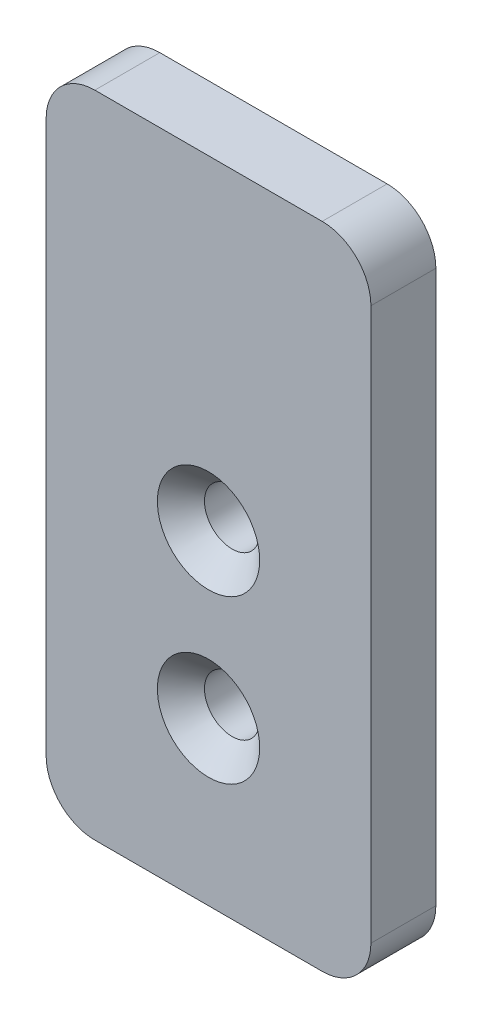
ISO-10303-21;
HEADER;
FILE_DESCRIPTION(('STEP AP214'),'2;1');
FILE_NAME('part.step','',(''),(''),'','','');
FILE_SCHEMA(('AUTOMOTIVE_DESIGN { 1 0 10303 214 1 1 1 1 }'));
ENDSEC;
DATA;
#1=APPLICATION_CONTEXT('core data for automotive mechanical design processes');
#2=APPLICATION_PROTOCOL_DEFINITION('international standard','automotive_design',2000,#1);
#3=PRODUCT_CONTEXT('',#1,'mechanical');
#4=PRODUCT('Part','Part','',(#3));
#5=PRODUCT_RELATED_PRODUCT_CATEGORY('part','',(#4));
#6=PRODUCT_DEFINITION_FORMATION('','',#4);
#7=PRODUCT_DEFINITION_CONTEXT('part definition',#1,'design');
#8=PRODUCT_DEFINITION('design','',#6,#7);
#9=PRODUCT_DEFINITION_SHAPE('','',#8);
#10=(LENGTH_UNIT() NAMED_UNIT(*) SI_UNIT(.MILLI.,.METRE.));
#11=(NAMED_UNIT(*) PLANE_ANGLE_UNIT() SI_UNIT($,.RADIAN.));
#12=(NAMED_UNIT(*) SI_UNIT($,.STERADIAN.) SOLID_ANGLE_UNIT());
#13=UNCERTAINTY_MEASURE_WITH_UNIT(LENGTH_MEASURE(1.E-05),#10,'distance_accuracy_value','');
#14=(GEOMETRIC_REPRESENTATION_CONTEXT(3) GLOBAL_UNCERTAINTY_ASSIGNED_CONTEXT((#13)) GLOBAL_UNIT_ASSIGNED_CONTEXT((#10,
#11,#12)) REPRESENTATION_CONTEXT('',''));
#15=CARTESIAN_POINT('',(0.,0.,0.));
#16=DIRECTION('',(0.,0.,1.));
#17=DIRECTION('',(1.,0.,0.));
#18=AXIS2_PLACEMENT_3D('',#15,#16,#17);
#19=CARTESIAN_POINT('',(10.,-20.,4.));
#20=DIRECTION('',(-1.,0.,0.));
#21=DIRECTION('',(0.,0.,1.));
#22=AXIS2_PLACEMENT_3D('',#19,#20,#21);
#23=PLANE('',#22);
#24=DIRECTION('',(0.,1.,0.));
#25=VECTOR('',#24,1.);
#26=CARTESIAN_POINT('',(10.,-20.,0.));
#27=LINE('',#26,#25);
#28=CARTESIAN_POINT('',(10.,-17.,0.));
#29=VERTEX_POINT('',#28);
#30=CARTESIAN_POINT('',(10.,17.,0.));
#31=VERTEX_POINT('',#30);
#32=EDGE_CURVE('E112',#29,#31,#27,.T.);
#33=ORIENTED_EDGE('',*,*,#32,.T.);
#34=DIRECTION('',(0.,0.,-1.));
#35=VECTOR('',#34,1.);
#36=CARTESIAN_POINT('',(10.,17.,4.));
#37=LINE('',#36,#35);
#38=CARTESIAN_POINT('',(10.,17.,4.));
#39=VERTEX_POINT('',#38);
#40=EDGE_CURVE('E135',#31,#39,#37,.F.);
#41=ORIENTED_EDGE('',*,*,#40,.T.);
#42=DIRECTION('',(0.,1.,0.));
#43=VECTOR('',#42,1.);
#44=CARTESIAN_POINT('',(10.,-20.,4.));
#45=LINE('',#44,#43);
#46=CARTESIAN_POINT('',(10.,-17.,4.));
#47=VERTEX_POINT('',#46);
#48=EDGE_CURVE('E110',#47,#39,#45,.T.);
#49=ORIENTED_EDGE('',*,*,#48,.F.);
#50=DIRECTION('',(0.,0.,-1.));
#51=VECTOR('',#50,1.);
#52=CARTESIAN_POINT('',(10.,-17.,4.));
#53=LINE('',#52,#51);
#54=EDGE_CURVE('E132',#47,#29,#53,.T.);
#55=ORIENTED_EDGE('',*,*,#54,.T.);
#56=EDGE_LOOP('',(#33,#41,#49,#55));
#57=FACE_BOUND('',#56,.T.);
#58=ADVANCED_FACE('F17',(#57),#23,.F.);
#59=CARTESIAN_POINT('',(-10.,20.,4.));
#60=DIRECTION('',(0.,-1.,0.));
#61=DIRECTION('',(0.,0.,-1.));
#62=AXIS2_PLACEMENT_3D('',#59,#60,#61);
#63=PLANE('',#62);
#64=DIRECTION('',(-1.,0.,0.));
#65=VECTOR('',#64,1.);
#66=CARTESIAN_POINT('',(-10.,20.,0.));
#67=LINE('',#66,#65);
#68=CARTESIAN_POINT('',(7.,20.,0.));
#69=VERTEX_POINT('',#68);
#70=CARTESIAN_POINT('',(-7.,20.,0.));
#71=VERTEX_POINT('',#70);
#72=EDGE_CURVE('E108',#69,#71,#67,.T.);
#73=ORIENTED_EDGE('',*,*,#72,.T.);
#74=DIRECTION('',(0.,0.,-1.));
#75=VECTOR('',#74,1.);
#76=CARTESIAN_POINT('',(-7.,20.,4.));
#77=LINE('',#76,#75);
#78=CARTESIAN_POINT('',(-7.,20.,4.));
#79=VERTEX_POINT('',#78);
#80=EDGE_CURVE('E87',#71,#79,#77,.F.);
#81=ORIENTED_EDGE('',*,*,#80,.T.);
#82=DIRECTION('',(-1.,0.,0.));
#83=VECTOR('',#82,1.);
#84=CARTESIAN_POINT('',(-10.,20.,4.));
#85=LINE('',#84,#83);
#86=CARTESIAN_POINT('',(7.,20.,4.));
#87=VERTEX_POINT('',#86);
#88=EDGE_CURVE('E151',#87,#79,#85,.T.);
#89=ORIENTED_EDGE('',*,*,#88,.F.);
#90=DIRECTION('',(0.,0.,-1.));
#91=VECTOR('',#90,1.);
#92=CARTESIAN_POINT('',(7.,20.,4.));
#93=LINE('',#92,#91);
#94=EDGE_CURVE('E92',#87,#69,#93,.T.);
#95=ORIENTED_EDGE('',*,*,#94,.T.);
#96=EDGE_LOOP('',(#73,#81,#89,#95));
#97=FACE_BOUND('',#96,.T.);
#98=ADVANCED_FACE('F191',(#97),#63,.F.);
#99=CARTESIAN_POINT('',(-10.,-20.,4.));
#100=DIRECTION('',(1.,0.,0.));
#101=DIRECTION('',(0.,0.,-1.));
#102=AXIS2_PLACEMENT_3D('',#99,#100,#101);
#103=PLANE('',#102);
#104=DIRECTION('',(0.,-1.,0.));
#105=VECTOR('',#104,1.);
#106=CARTESIAN_POINT('',(-10.,-20.,4.));
#107=LINE('',#106,#105);
#108=CARTESIAN_POINT('',(-10.,17.,4.));
#109=VERTEX_POINT('',#108);
#110=CARTESIAN_POINT('',(-10.,-17.,4.));
#111=VERTEX_POINT('',#110);
#112=EDGE_CURVE('E101',#109,#111,#107,.T.);
#113=ORIENTED_EDGE('',*,*,#112,.F.);
#114=DIRECTION('',(0.,0.,-1.));
#115=VECTOR('',#114,1.);
#116=CARTESIAN_POINT('',(-10.,17.,4.));
#117=LINE('',#116,#115);
#118=CARTESIAN_POINT('',(-10.,17.,0.));
#119=VERTEX_POINT('',#118);
#120=EDGE_CURVE('E86',#109,#119,#117,.T.);
#121=ORIENTED_EDGE('',*,*,#120,.T.);
#122=DIRECTION('',(0.,-1.,0.));
#123=VECTOR('',#122,1.);
#124=CARTESIAN_POINT('',(-10.,-20.,0.));
#125=LINE('',#124,#123);
#126=CARTESIAN_POINT('',(-10.,-17.,0.));
#127=VERTEX_POINT('',#126);
#128=EDGE_CURVE('E99',#119,#127,#125,.T.);
#129=ORIENTED_EDGE('',*,*,#128,.T.);
#130=DIRECTION('',(0.,0.,-1.));
#131=VECTOR('',#130,1.);
#132=CARTESIAN_POINT('',(-10.,-17.,4.));
#133=LINE('',#132,#131);
#134=EDGE_CURVE('E103',#127,#111,#133,.F.);
#135=ORIENTED_EDGE('',*,*,#134,.T.);
#136=EDGE_LOOP('',(#113,#121,#129,#135));
#137=FACE_BOUND('',#136,.T.);
#138=ADVANCED_FACE('F98',(#137),#103,.F.);
#139=CARTESIAN_POINT('',(-10.,-20.,4.));
#140=DIRECTION('',(0.,1.,0.));
#141=DIRECTION('',(0.,0.,1.));
#142=AXIS2_PLACEMENT_3D('',#139,#140,#141);
#143=PLANE('',#142);
#144=DIRECTION('',(1.,0.,0.));
#145=VECTOR('',#144,1.);
#146=CARTESIAN_POINT('',(-10.,-20.,0.));
#147=LINE('',#146,#145);
#148=CARTESIAN_POINT('',(-7.,-20.,0.));
#149=VERTEX_POINT('',#148);
#150=CARTESIAN_POINT('',(7.,-20.,0.));
#151=VERTEX_POINT('',#150);
#152=EDGE_CURVE('E107',#149,#151,#147,.T.);
#153=ORIENTED_EDGE('',*,*,#152,.T.);
#154=DIRECTION('',(0.,0.,-1.));
#155=VECTOR('',#154,1.);
#156=CARTESIAN_POINT('',(7.,-20.,4.));
#157=LINE('',#156,#155);
#158=CARTESIAN_POINT('',(7.,-20.,4.));
#159=VERTEX_POINT('',#158);
#160=EDGE_CURVE('E11',#151,#159,#157,.F.);
#161=ORIENTED_EDGE('',*,*,#160,.T.);
#162=DIRECTION('',(1.,0.,0.));
#163=VECTOR('',#162,1.);
#164=CARTESIAN_POINT('',(-10.,-20.,4.));
#165=LINE('',#164,#163);
#166=CARTESIAN_POINT('',(-7.,-20.,4.));
#167=VERTEX_POINT('',#166);
#168=EDGE_CURVE('E116',#167,#159,#165,.T.);
#169=ORIENTED_EDGE('',*,*,#168,.F.);
#170=DIRECTION('',(0.,0.,-1.));
#171=VECTOR('',#170,1.);
#172=CARTESIAN_POINT('',(-7.,-20.,4.));
#173=LINE('',#172,#171);
#174=EDGE_CURVE('E25',#167,#149,#173,.T.);
#175=ORIENTED_EDGE('',*,*,#174,.T.);
#176=EDGE_LOOP('',(#153,#161,#169,#175));
#177=FACE_BOUND('',#176,.T.);
#178=ADVANCED_FACE('F138',(#177),#143,.F.);
#179=CARTESIAN_POINT('',(0.,0.,4.));
#180=DIRECTION('',(0.,0.,-1.));
#181=DIRECTION('',(-1.,0.,0.));
#182=AXIS2_PLACEMENT_3D('',#179,#180,#181);
#183=PLANE('',#182);
#184=CARTESIAN_POINT('',(0.,0.,4.));
#185=DIRECTION('',(0.,0.,1.));
#186=DIRECTION('',(1.,0.,0.));
#187=AXIS2_PLACEMENT_3D('',#184,#185,#186);
#188=CIRCLE('',#187,3.15);
#189=CARTESIAN_POINT('',(3.15,0.,4.));
#190=VERTEX_POINT('',#189);
#191=EDGE_CURVE('E177',#190,#190,#188,.T.);
#192=ORIENTED_EDGE('',*,*,#191,.F.);
#193=EDGE_LOOP('',(#192));
#194=FACE_BOUND('',#193,.T.);
#195=CARTESIAN_POINT('',(0.,-10.,4.));
#196=DIRECTION('',(0.,0.,1.));
#197=DIRECTION('',(1.,0.,0.));
#198=AXIS2_PLACEMENT_3D('',#195,#196,#197);
#199=CIRCLE('',#198,3.15);
#200=CARTESIAN_POINT('',(3.15,-10.,4.));
#201=VERTEX_POINT('',#200);
#202=EDGE_CURVE('E165',#201,#201,#199,.T.);
#203=ORIENTED_EDGE('',*,*,#202,.F.);
#204=EDGE_LOOP('',(#203));
#205=FACE_BOUND('',#204,.T.);
#206=ORIENTED_EDGE('',*,*,#88,.T.);
#207=CARTESIAN_POINT('',(-7.,17.,4.));
#208=DIRECTION('',(0.,0.,-1.));
#209=DIRECTION('',(-1.,0.,0.));
#210=AXIS2_PLACEMENT_3D('',#207,#208,#209);
#211=CIRCLE('',#210,3.);
#212=EDGE_CURVE('E130',#79,#109,#211,.F.);
#213=ORIENTED_EDGE('',*,*,#212,.T.);
#214=ORIENTED_EDGE('',*,*,#112,.T.);
#215=CARTESIAN_POINT('',(-7.,-17.,4.));
#216=DIRECTION('',(0.,0.,-1.));
#217=DIRECTION('',(-1.,0.,0.));
#218=AXIS2_PLACEMENT_3D('',#215,#216,#217);
#219=CIRCLE('',#218,3.);
#220=EDGE_CURVE('E37',#111,#167,#219,.F.);
#221=ORIENTED_EDGE('',*,*,#220,.T.);
#222=ORIENTED_EDGE('',*,*,#168,.T.);
#223=CARTESIAN_POINT('',(7.,-17.,4.));
#224=DIRECTION('',(0.,0.,-1.));
#225=DIRECTION('',(-1.,0.,0.));
#226=AXIS2_PLACEMENT_3D('',#223,#224,#225);
#227=CIRCLE('',#226,3.);
#228=EDGE_CURVE('E126',#159,#47,#227,.F.);
#229=ORIENTED_EDGE('',*,*,#228,.T.);
#230=ORIENTED_EDGE('',*,*,#48,.T.);
#231=CARTESIAN_POINT('',(7.,17.,4.));
#232=DIRECTION('',(0.,0.,-1.));
#233=DIRECTION('',(-1.,0.,0.));
#234=AXIS2_PLACEMENT_3D('',#231,#232,#233);
#235=CIRCLE('',#234,3.);
#236=EDGE_CURVE('E128',#39,#87,#235,.F.);
#237=ORIENTED_EDGE('',*,*,#236,.T.);
#238=EDGE_LOOP('',(#206,#213,#214,#221,#222,#229,#230,#237));
#239=FACE_BOUND('',#238,.T.);
#240=ADVANCED_FACE('F183',(#194,#205,#239),#183,.F.);
#241=CARTESIAN_POINT('',(0.,0.,0.));
#242=DIRECTION('',(0.,0.,-1.));
#243=DIRECTION('',(-1.,0.,0.));
#244=AXIS2_PLACEMENT_3D('',#241,#242,#243);
#245=PLANE('',#244);
#246=CARTESIAN_POINT('',(0.,0.,0.));
#247=DIRECTION('',(0.,0.,1.));
#248=DIRECTION('',(1.,0.,0.));
#249=AXIS2_PLACEMENT_3D('',#246,#247,#248);
#250=CIRCLE('',#249,1.7);
#251=CARTESIAN_POINT('',(1.7,0.,0.));
#252=VERTEX_POINT('',#251);
#253=EDGE_CURVE('E169',#252,#252,#250,.T.);
#254=ORIENTED_EDGE('',*,*,#253,.T.);
#255=EDGE_LOOP('',(#254));
#256=FACE_BOUND('',#255,.T.);
#257=CARTESIAN_POINT('',(0.,-10.,0.));
#258=DIRECTION('',(0.,0.,1.));
#259=DIRECTION('',(1.,0.,0.));
#260=AXIS2_PLACEMENT_3D('',#257,#258,#259);
#261=CIRCLE('',#260,1.7);
#262=CARTESIAN_POINT('',(1.7,-10.,0.));
#263=VERTEX_POINT('',#262);
#264=EDGE_CURVE('E156',#263,#263,#261,.T.);
#265=ORIENTED_EDGE('',*,*,#264,.T.);
#266=EDGE_LOOP('',(#265));
#267=FACE_BOUND('',#266,.T.);
#268=ORIENTED_EDGE('',*,*,#128,.F.);
#269=CARTESIAN_POINT('',(-7.,17.,0.));
#270=DIRECTION('',(0.,0.,-1.));
#271=DIRECTION('',(-1.,0.,0.));
#272=AXIS2_PLACEMENT_3D('',#269,#270,#271);
#273=CIRCLE('',#272,3.);
#274=EDGE_CURVE('E82',#119,#71,#273,.T.);
#275=ORIENTED_EDGE('',*,*,#274,.T.);
#276=ORIENTED_EDGE('',*,*,#72,.F.);
#277=CARTESIAN_POINT('',(7.,17.,0.));
#278=DIRECTION('',(0.,0.,-1.));
#279=DIRECTION('',(-1.,0.,0.));
#280=AXIS2_PLACEMENT_3D('',#277,#278,#279);
#281=CIRCLE('',#280,3.);
#282=EDGE_CURVE('E93',#69,#31,#281,.T.);
#283=ORIENTED_EDGE('',*,*,#282,.T.);
#284=ORIENTED_EDGE('',*,*,#32,.F.);
#285=CARTESIAN_POINT('',(7.,-17.,0.));
#286=DIRECTION('',(0.,0.,-1.));
#287=DIRECTION('',(-1.,0.,0.));
#288=AXIS2_PLACEMENT_3D('',#285,#286,#287);
#289=CIRCLE('',#288,3.);
#290=EDGE_CURVE('E119',#29,#151,#289,.T.);
#291=ORIENTED_EDGE('',*,*,#290,.T.);
#292=ORIENTED_EDGE('',*,*,#152,.F.);
#293=CARTESIAN_POINT('',(-7.,-17.,0.));
#294=DIRECTION('',(0.,0.,-1.));
#295=DIRECTION('',(-1.,0.,0.));
#296=AXIS2_PLACEMENT_3D('',#293,#294,#295);
#297=CIRCLE('',#296,3.);
#298=EDGE_CURVE('E102',#149,#127,#297,.T.);
#299=ORIENTED_EDGE('',*,*,#298,.T.);
#300=EDGE_LOOP('',(#268,#275,#276,#283,#284,#291,#292,#299));
#301=FACE_BOUND('',#300,.T.);
#302=ADVANCED_FACE('F105',(#256,#267,#301),#245,.T.);
#303=CARTESIAN_POINT('',(0.,-10.,4.));
#304=DIRECTION('',(0.,0.,1.));
#305=DIRECTION('',(1.,0.,0.));
#306=AXIS2_PLACEMENT_3D('',#303,#304,#305);
#307=CYLINDRICAL_SURFACE('',#306,1.7);
#308=ORIENTED_EDGE('',*,*,#264,.F.);
#309=EDGE_LOOP('',(#308));
#310=FACE_BOUND('',#309,.T.);
#311=CARTESIAN_POINT('',(0.,-10.,2.55));
#312=DIRECTION('',(0.,0.,1.));
#313=DIRECTION('',(1.,0.,0.));
#314=AXIS2_PLACEMENT_3D('',#311,#312,#313);
#315=CIRCLE('',#314,1.7);
#316=CARTESIAN_POINT('',(1.7,-10.,2.55));
#317=VERTEX_POINT('',#316);
#318=EDGE_CURVE('E161',#317,#317,#315,.T.);
#319=ORIENTED_EDGE('',*,*,#318,.T.);
#320=EDGE_LOOP('',(#319));
#321=FACE_BOUND('',#320,.T.);
#322=ADVANCED_FACE('F214',(#310,#321),#307,.F.);
#323=CARTESIAN_POINT('',(0.,-10.,4.));
#324=DIRECTION('',(0.,0.,1.));
#325=DIRECTION('',(1.,0.,0.));
#326=AXIS2_PLACEMENT_3D('',#323,#324,#325);
#327=CONICAL_SURFACE('',#326,3.15,0.785398163397448);
#328=ORIENTED_EDGE('',*,*,#318,.F.);
#329=EDGE_LOOP('',(#328));
#330=FACE_BOUND('',#329,.T.);
#331=ORIENTED_EDGE('',*,*,#202,.T.);
#332=EDGE_LOOP('',(#331));
#333=FACE_BOUND('',#332,.T.);
#334=ADVANCED_FACE('F219',(#330,#333),#327,.F.);
#335=CARTESIAN_POINT('',(0.,0.,4.));
#336=DIRECTION('',(0.,0.,1.));
#337=DIRECTION('',(1.,0.,0.));
#338=AXIS2_PLACEMENT_3D('',#335,#336,#337);
#339=CYLINDRICAL_SURFACE('',#338,1.7);
#340=ORIENTED_EDGE('',*,*,#253,.F.);
#341=EDGE_LOOP('',(#340));
#342=FACE_BOUND('',#341,.T.);
#343=CARTESIAN_POINT('',(0.,0.,2.55));
#344=DIRECTION('',(0.,0.,1.));
#345=DIRECTION('',(1.,0.,0.));
#346=AXIS2_PLACEMENT_3D('',#343,#344,#345);
#347=CIRCLE('',#346,1.7);
#348=CARTESIAN_POINT('',(1.7,0.,2.55));
#349=VERTEX_POINT('',#348);
#350=EDGE_CURVE('E174',#349,#349,#347,.T.);
#351=ORIENTED_EDGE('',*,*,#350,.T.);
#352=EDGE_LOOP('',(#351));
#353=FACE_BOUND('',#352,.T.);
#354=ADVANCED_FACE('F223',(#342,#353),#339,.F.);
#355=CARTESIAN_POINT('',(0.,0.,4.));
#356=DIRECTION('',(0.,0.,1.));
#357=DIRECTION('',(1.,0.,0.));
#358=AXIS2_PLACEMENT_3D('',#355,#356,#357);
#359=CONICAL_SURFACE('',#358,3.15,0.785398163397448);
#360=ORIENTED_EDGE('',*,*,#350,.F.);
#361=EDGE_LOOP('',(#360));
#362=FACE_BOUND('',#361,.T.);
#363=ORIENTED_EDGE('',*,*,#191,.T.);
#364=EDGE_LOOP('',(#363));
#365=FACE_BOUND('',#364,.T.);
#366=ADVANCED_FACE('F181',(#362,#365),#359,.F.);
#367=CARTESIAN_POINT('',(-7.,17.,4.));
#368=DIRECTION('',(0.,0.,-1.));
#369=DIRECTION('',(-1.,0.,0.));
#370=AXIS2_PLACEMENT_3D('',#367,#368,#369);
#371=CYLINDRICAL_SURFACE('',#370,3.);
#372=ORIENTED_EDGE('',*,*,#212,.F.);
#373=ORIENTED_EDGE('',*,*,#80,.F.);
#374=ORIENTED_EDGE('',*,*,#274,.F.);
#375=ORIENTED_EDGE('',*,*,#120,.F.);
#376=EDGE_LOOP('',(#372,#373,#374,#375));
#377=FACE_BOUND('',#376,.T.);
#378=ADVANCED_FACE('F85',(#377),#371,.T.);
#379=CARTESIAN_POINT('',(7.,17.,4.));
#380=DIRECTION('',(0.,0.,-1.));
#381=DIRECTION('',(-1.,0.,0.));
#382=AXIS2_PLACEMENT_3D('',#379,#380,#381);
#383=CYLINDRICAL_SURFACE('',#382,3.);
#384=ORIENTED_EDGE('',*,*,#236,.F.);
#385=ORIENTED_EDGE('',*,*,#40,.F.);
#386=ORIENTED_EDGE('',*,*,#282,.F.);
#387=ORIENTED_EDGE('',*,*,#94,.F.);
#388=EDGE_LOOP('',(#384,#385,#386,#387));
#389=FACE_BOUND('',#388,.T.);
#390=ADVANCED_FACE('F193',(#389),#383,.T.);
#391=CARTESIAN_POINT('',(7.,-17.,4.));
#392=DIRECTION('',(0.,0.,-1.));
#393=DIRECTION('',(-1.,0.,0.));
#394=AXIS2_PLACEMENT_3D('',#391,#392,#393);
#395=CYLINDRICAL_SURFACE('',#394,3.);
#396=ORIENTED_EDGE('',*,*,#228,.F.);
#397=ORIENTED_EDGE('',*,*,#160,.F.);
#398=ORIENTED_EDGE('',*,*,#290,.F.);
#399=ORIENTED_EDGE('',*,*,#54,.F.);
#400=EDGE_LOOP('',(#396,#397,#398,#399));
#401=FACE_BOUND('',#400,.T.);
#402=ADVANCED_FACE('F145',(#401),#395,.T.);
#403=CARTESIAN_POINT('',(-7.,-17.,4.));
#404=DIRECTION('',(0.,0.,-1.));
#405=DIRECTION('',(-1.,0.,0.));
#406=AXIS2_PLACEMENT_3D('',#403,#404,#405);
#407=CYLINDRICAL_SURFACE('',#406,3.);
#408=ORIENTED_EDGE('',*,*,#220,.F.);
#409=ORIENTED_EDGE('',*,*,#134,.F.);
#410=ORIENTED_EDGE('',*,*,#298,.F.);
#411=ORIENTED_EDGE('',*,*,#174,.F.);
#412=EDGE_LOOP('',(#408,#409,#410,#411));
#413=FACE_BOUND('',#412,.T.);
#414=ADVANCED_FACE('F19',(#413),#407,.T.);
#415=CLOSED_SHELL('',(#58,#98,#138,#178,#240,#302,#322,#334,#354,#366,#378,#390,#402,#414));
#416=MANIFOLD_SOLID_BREP('B1',#415);
#417=ADVANCED_BREP_SHAPE_REPRESENTATION('',(#18,#416),#14);
#418=SHAPE_DEFINITION_REPRESENTATION(#9,#417);
ENDSEC;
END-ISO-10303-21;
